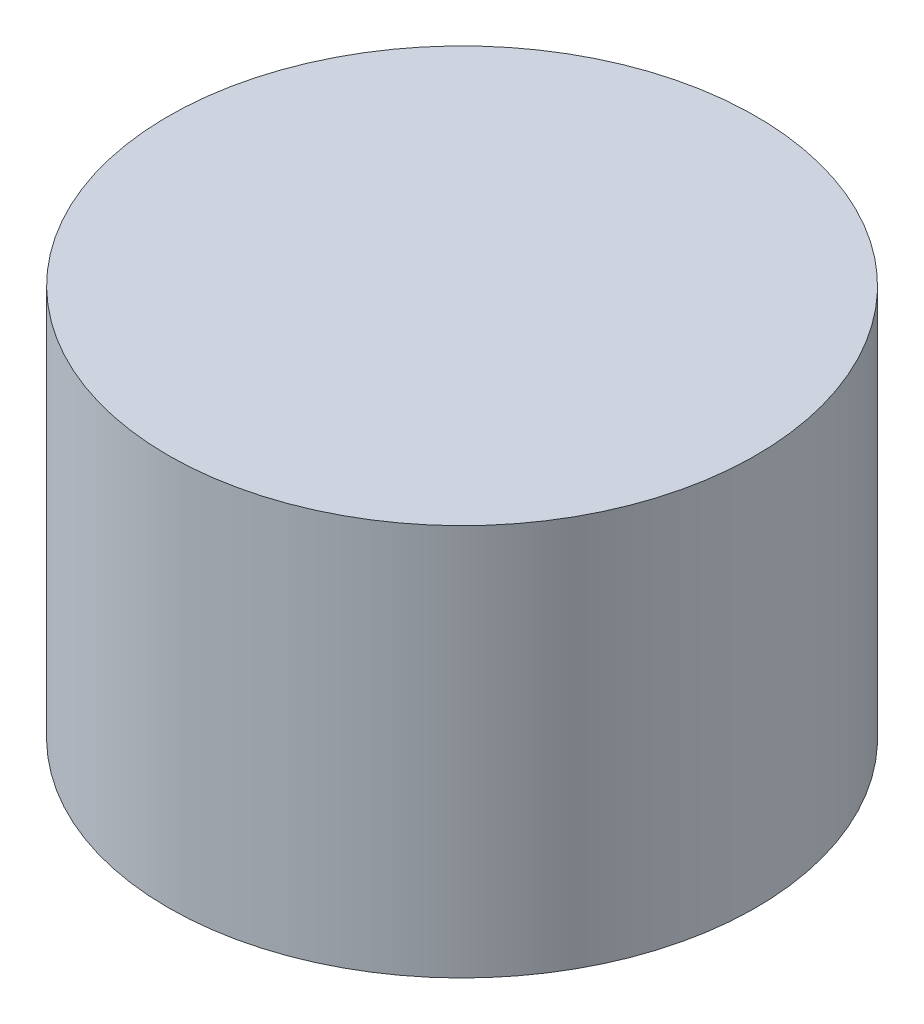
ISO-10303-21;
HEADER;
FILE_DESCRIPTION(('STEP AP214'),'2;1');
FILE_NAME('part.step','',(''),(''),'','','');
FILE_SCHEMA(('AUTOMOTIVE_DESIGN { 1 0 10303 214 1 1 1 1 }'));
ENDSEC;
DATA;
#1=APPLICATION_CONTEXT('core data for automotive mechanical design processes');
#2=APPLICATION_PROTOCOL_DEFINITION('international standard','automotive_design',2000,#1);
#3=PRODUCT_CONTEXT('',#1,'mechanical');
#4=PRODUCT('Part','Part','',(#3));
#5=PRODUCT_RELATED_PRODUCT_CATEGORY('part','',(#4));
#6=PRODUCT_DEFINITION_FORMATION('','',#4);
#7=PRODUCT_DEFINITION_CONTEXT('part definition',#1,'design');
#8=PRODUCT_DEFINITION('design','',#6,#7);
#9=PRODUCT_DEFINITION_SHAPE('','',#8);
#10=(LENGTH_UNIT() NAMED_UNIT(*) SI_UNIT(.MILLI.,.METRE.));
#11=(NAMED_UNIT(*) PLANE_ANGLE_UNIT() SI_UNIT($,.RADIAN.));
#12=(NAMED_UNIT(*) SI_UNIT($,.STERADIAN.) SOLID_ANGLE_UNIT());
#13=UNCERTAINTY_MEASURE_WITH_UNIT(LENGTH_MEASURE(1.E-05),#10,'distance_accuracy_value','');
#14=(GEOMETRIC_REPRESENTATION_CONTEXT(3) GLOBAL_UNCERTAINTY_ASSIGNED_CONTEXT((#13)) GLOBAL_UNIT_ASSIGNED_CONTEXT((#10,
#11,#12)) REPRESENTATION_CONTEXT('',''));
#15=CARTESIAN_POINT('',(0.,0.,0.));
#16=DIRECTION('',(0.,0.,1.));
#17=DIRECTION('',(1.,0.,0.));
#18=AXIS2_PLACEMENT_3D('',#15,#16,#17);
#19=CARTESIAN_POINT('',(0.,5.08,0.));
#20=DIRECTION('',(0.,-1.,0.));
#21=DIRECTION('',(0.,0.,-1.));
#22=AXIS2_PLACEMENT_3D('',#19,#20,#21);
#23=CYLINDRICAL_SURFACE('',#22,3.81);
#24=CARTESIAN_POINT('',(0.,5.08,0.));
#25=DIRECTION('',(0.,1.,0.));
#26=DIRECTION('',(0.,0.,1.));
#27=AXIS2_PLACEMENT_3D('',#24,#25,#26);
#28=CIRCLE('',#27,3.81);
#29=CARTESIAN_POINT('',(0.,5.08,3.81));
#30=VERTEX_POINT('',#29);
#31=EDGE_CURVE('E10',#30,#30,#28,.T.);
#32=ORIENTED_EDGE('',*,*,#31,.F.);
#33=EDGE_LOOP('',(#32));
#34=FACE_BOUND('',#33,.T.);
#35=CARTESIAN_POINT('',(0.,0.,0.));
#36=DIRECTION('',(0.,1.,0.));
#37=DIRECTION('',(0.,0.,1.));
#38=AXIS2_PLACEMENT_3D('',#35,#36,#37);
#39=CIRCLE('',#38,3.81);
#40=CARTESIAN_POINT('',(0.,0.,3.81));
#41=VERTEX_POINT('',#40);
#42=EDGE_CURVE('E33',#41,#41,#39,.T.);
#43=ORIENTED_EDGE('',*,*,#42,.T.);
#44=EDGE_LOOP('',(#43));
#45=FACE_BOUND('',#44,.T.);
#46=ADVANCED_FACE('F30',(#34,#45),#23,.T.);
#47=CARTESIAN_POINT('',(0.,5.08,0.));
#48=DIRECTION('',(0.,1.,0.));
#49=DIRECTION('',(0.,0.,1.));
#50=AXIS2_PLACEMENT_3D('',#47,#48,#49);
#51=PLANE('',#50);
#52=ORIENTED_EDGE('',*,*,#31,.T.);
#53=EDGE_LOOP('',(#52));
#54=FACE_BOUND('',#53,.T.);
#55=ADVANCED_FACE('F45',(#54),#51,.T.);
#56=CARTESIAN_POINT('',(0.,0.,0.));
#57=DIRECTION('',(0.,1.,0.));
#58=DIRECTION('',(0.,0.,1.));
#59=AXIS2_PLACEMENT_3D('',#56,#57,#58);
#60=PLANE('',#59);
#61=ORIENTED_EDGE('',*,*,#42,.F.);
#62=EDGE_LOOP('',(#61));
#63=FACE_BOUND('',#62,.T.);
#64=ADVANCED_FACE('F43',(#63),#60,.F.);
#65=CLOSED_SHELL('',(#46,#55,#64));
#66=MANIFOLD_SOLID_BREP('B2',#65);
#67=ADVANCED_BREP_SHAPE_REPRESENTATION('',(#18,#66),#14);
#68=SHAPE_DEFINITION_REPRESENTATION(#9,#67);
ENDSEC;
END-ISO-10303-21;
